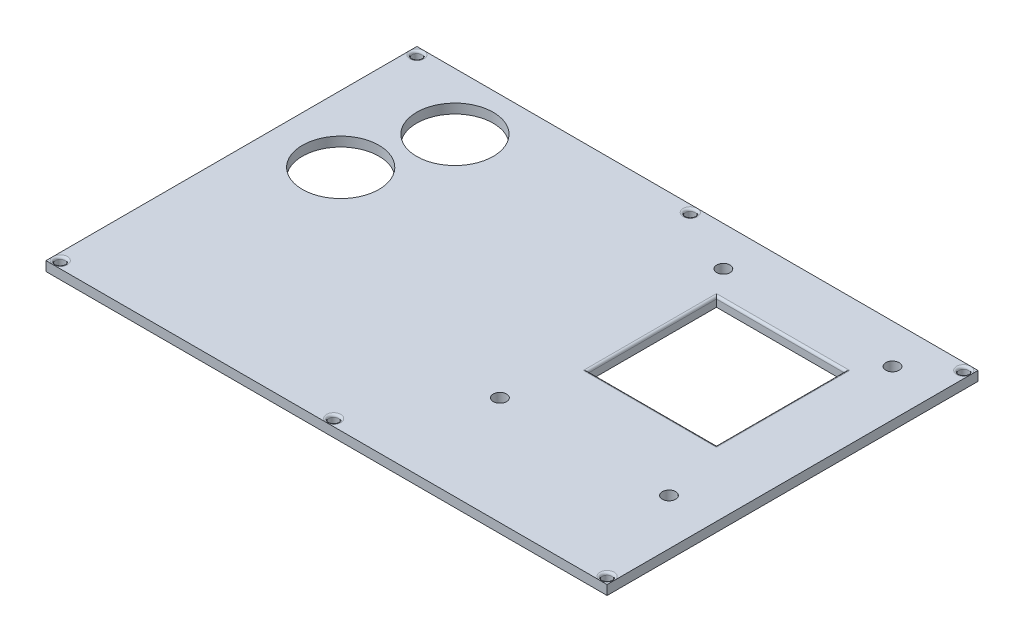
ISO-10303-21;
HEADER;
FILE_DESCRIPTION(('STEP AP214'),'2;1');
FILE_NAME('part.step','',(''),(''),'','','');
FILE_SCHEMA(('AUTOMOTIVE_DESIGN { 1 0 10303 214 1 1 1 1 }'));
ENDSEC;
DATA;
#1=APPLICATION_CONTEXT('core data for automotive mechanical design processes');
#2=APPLICATION_PROTOCOL_DEFINITION('international standard','automotive_design',2000,#1);
#3=PRODUCT_CONTEXT('',#1,'mechanical');
#4=PRODUCT('Part','Part','',(#3));
#5=PRODUCT_RELATED_PRODUCT_CATEGORY('part','',(#4));
#6=PRODUCT_DEFINITION_FORMATION('','',#4);
#7=PRODUCT_DEFINITION_CONTEXT('part definition',#1,'design');
#8=PRODUCT_DEFINITION('design','',#6,#7);
#9=PRODUCT_DEFINITION_SHAPE('','',#8);
#10=(LENGTH_UNIT() NAMED_UNIT(*) SI_UNIT(.MILLI.,.METRE.));
#11=(NAMED_UNIT(*) PLANE_ANGLE_UNIT() SI_UNIT($,.RADIAN.));
#12=(NAMED_UNIT(*) SI_UNIT($,.STERADIAN.) SOLID_ANGLE_UNIT());
#13=UNCERTAINTY_MEASURE_WITH_UNIT(LENGTH_MEASURE(1.E-05),#10,'distance_accuracy_value','');
#14=(GEOMETRIC_REPRESENTATION_CONTEXT(3) GLOBAL_UNCERTAINTY_ASSIGNED_CONTEXT((#13)) GLOBAL_UNIT_ASSIGNED_CONTEXT((#10,
#11,#12)) REPRESENTATION_CONTEXT('',''));
#15=CARTESIAN_POINT('',(0.,0.,0.));
#16=DIRECTION('',(0.,0.,1.));
#17=DIRECTION('',(1.,0.,0.));
#18=AXIS2_PLACEMENT_3D('',#15,#16,#17);
#19=CARTESIAN_POINT('',(0.,2.,0.));
#20=DIRECTION('',(0.,1.,0.));
#21=DIRECTION('',(0.,0.,1.));
#22=AXIS2_PLACEMENT_3D('',#19,#20,#21);
#23=PLANE('',#22);
#24=DIRECTION('',(1.,0.,0.));
#25=VECTOR('',#24,1.);
#26=CARTESIAN_POINT('',(18.,2.,2.50000000000001));
#27=LINE('',#26,#25);
#28=CARTESIAN_POINT('',(45.5,2.,2.50000000000001));
#29=VERTEX_POINT('',#28);
#30=CARTESIAN_POINT('',(17.5,2.,2.50000000000001));
#31=VERTEX_POINT('',#30);
#32=EDGE_CURVE('E305',#29,#31,#27,.F.);
#33=ORIENTED_EDGE('',*,*,#32,.T.);
#34=DIRECTION('',(0.,0.,1.));
#35=VECTOR('',#34,1.);
#36=CARTESIAN_POINT('',(17.5,2.,-25.));
#37=LINE('',#36,#35);
#38=CARTESIAN_POINT('',(17.5,2.,-25.5));
#39=VERTEX_POINT('',#38);
#40=EDGE_CURVE('E314',#31,#39,#37,.F.);
#41=ORIENTED_EDGE('',*,*,#40,.T.);
#42=DIRECTION('',(-1.,0.,0.));
#43=VECTOR('',#42,1.);
#44=CARTESIAN_POINT('',(45.,2.,-25.5));
#45=LINE('',#44,#43);
#46=CARTESIAN_POINT('',(45.5,2.,-25.5));
#47=VERTEX_POINT('',#46);
#48=EDGE_CURVE('E311',#39,#47,#45,.F.);
#49=ORIENTED_EDGE('',*,*,#48,.T.);
#50=DIRECTION('',(0.,0.,-1.));
#51=VECTOR('',#50,1.);
#52=CARTESIAN_POINT('',(45.5,2.,2.00000000000001));
#53=LINE('',#52,#51);
#54=EDGE_CURVE('E308',#47,#29,#53,.F.);
#55=ORIENTED_EDGE('',*,*,#54,.T.);
#56=EDGE_LOOP('',(#33,#41,#49,#55));
#57=FACE_BOUND('',#56,.T.);
#58=CARTESIAN_POINT('',(-45.,2.,-8.97224362268004));
#59=DIRECTION('',(0.,1.,0.));
#60=DIRECTION('',(0.,0.,1.));
#61=AXIS2_PLACEMENT_3D('',#58,#59,#60);
#62=CIRCLE('',#61,8.05);
#63=CARTESIAN_POINT('',(-45.,2.,-0.922243622680039));
#64=VERTEX_POINT('',#63);
#65=EDGE_CURVE('E193',#64,#64,#62,.T.);
#66=ORIENTED_EDGE('',*,*,#65,.F.);
#67=EDGE_LOOP('',(#66));
#68=FACE_BOUND('',#67,.T.);
#69=CARTESIAN_POINT('',(-39.0000000000001,2.,-27.));
#70=DIRECTION('',(0.,1.,0.));
#71=DIRECTION('',(0.,0.,1.));
#72=AXIS2_PLACEMENT_3D('',#69,#70,#71);
#73=CIRCLE('',#72,8.05);
#74=CARTESIAN_POINT('',(-39.0000000000001,2.,-18.95));
#75=VERTEX_POINT('',#74);
#76=EDGE_CURVE('E204',#75,#75,#73,.T.);
#77=ORIENTED_EDGE('',*,*,#76,.F.);
#78=EDGE_LOOP('',(#77));
#79=FACE_BOUND('',#78,.T.);
#80=CARTESIAN_POINT('',(13.72,2.,-30.7313466296643));
#81=DIRECTION('',(0.,1.,0.));
#82=DIRECTION('',(0.,0.,1.));
#83=AXIS2_PLACEMENT_3D('',#80,#81,#82);
#84=CIRCLE('',#83,1.4);
#85=CARTESIAN_POINT('',(13.72,2.,-29.3313466296643));
#86=VERTEX_POINT('',#85);
#87=EDGE_CURVE('E180',#86,#86,#84,.T.);
#88=ORIENTED_EDGE('',*,*,#87,.F.);
#89=EDGE_LOOP('',(#88));
#90=FACE_BOUND('',#89,.T.);
#91=CARTESIAN_POINT('',(49.28,2.,-30.7313466296643));
#92=DIRECTION('',(0.,1.,0.));
#93=DIRECTION('',(0.,0.,1.));
#94=AXIS2_PLACEMENT_3D('',#91,#92,#93);
#95=CIRCLE('',#94,1.4);
#96=CARTESIAN_POINT('',(49.28,2.,-29.3313466296643));
#97=VERTEX_POINT('',#96);
#98=EDGE_CURVE('E395',#97,#97,#95,.T.);
#99=ORIENTED_EDGE('',*,*,#98,.F.);
#100=EDGE_LOOP('',(#99));
#101=FACE_BOUND('',#100,.T.);
#102=CARTESIAN_POINT('',(13.72,2.,16.2586533703357));
#103=DIRECTION('',(0.,1.,0.));
#104=DIRECTION('',(0.,0.,1.));
#105=AXIS2_PLACEMENT_3D('',#102,#103,#104);
#106=CIRCLE('',#105,1.4);
#107=CARTESIAN_POINT('',(13.72,2.,17.6586533703357));
#108=VERTEX_POINT('',#107);
#109=EDGE_CURVE('E403',#108,#108,#106,.T.);
#110=ORIENTED_EDGE('',*,*,#109,.F.);
#111=EDGE_LOOP('',(#110));
#112=FACE_BOUND('',#111,.T.);
#113=CARTESIAN_POINT('',(49.28,2.,16.2586533703357));
#114=DIRECTION('',(0.,1.,0.));
#115=DIRECTION('',(0.,0.,1.));
#116=AXIS2_PLACEMENT_3D('',#113,#114,#115);
#117=CIRCLE('',#116,1.4);
#118=CARTESIAN_POINT('',(49.28,2.,17.6586533703357));
#119=VERTEX_POINT('',#118);
#120=EDGE_CURVE('E183',#119,#119,#117,.T.);
#121=ORIENTED_EDGE('',*,*,#120,.F.);
#122=EDGE_LOOP('',(#121));
#123=FACE_BOUND('',#122,.T.);
#124=DIRECTION('',(1.,0.,0.));
#125=VECTOR('',#124,1.);
#126=CARTESIAN_POINT('',(-59.,2.,39.));
#127=LINE('',#126,#125);
#128=CARTESIAN_POINT('',(0.,2.,39.));
#129=VERTEX_POINT('',#128);
#130=CARTESIAN_POINT('',(57.5,2.,39.));
#131=VERTEX_POINT('',#130);
#132=EDGE_CURVE('E425',#129,#131,#127,.T.);
#133=ORIENTED_EDGE('',*,*,#132,.T.);
#134=CARTESIAN_POINT('',(57.5,2.,37.5));
#135=DIRECTION('',(0.,1.,0.));
#136=DIRECTION('',(0.,0.,1.));
#137=AXIS2_PLACEMENT_3D('',#134,#135,#136);
#138=CIRCLE('',#137,1.5);
#139=CARTESIAN_POINT('',(59.,2.,37.5));
#140=VERTEX_POINT('',#139);
#141=EDGE_CURVE('E301',#131,#140,#138,.F.);
#142=ORIENTED_EDGE('',*,*,#141,.T.);
#143=DIRECTION('',(0.,0.,-1.));
#144=VECTOR('',#143,1.);
#145=CARTESIAN_POINT('',(59.,2.,-39.));
#146=LINE('',#145,#144);
#147=CARTESIAN_POINT('',(59.,2.,-37.5));
#148=VERTEX_POINT('',#147);
#149=EDGE_CURVE('E220',#140,#148,#146,.T.);
#150=ORIENTED_EDGE('',*,*,#149,.T.);
#151=CARTESIAN_POINT('',(57.5,2.,-37.5));
#152=DIRECTION('',(0.,1.,0.));
#153=DIRECTION('',(0.,0.,1.));
#154=AXIS2_PLACEMENT_3D('',#151,#152,#153);
#155=CIRCLE('',#154,1.5);
#156=CARTESIAN_POINT('',(57.5,2.,-39.));
#157=VERTEX_POINT('',#156);
#158=EDGE_CURVE('E291',#148,#157,#155,.F.);
#159=ORIENTED_EDGE('',*,*,#158,.T.);
#160=DIRECTION('',(-1.,0.,0.));
#161=VECTOR('',#160,1.);
#162=CARTESIAN_POINT('',(-59.,2.,-39.));
#163=LINE('',#162,#161);
#164=CARTESIAN_POINT('',(0.,2.,-39.));
#165=VERTEX_POINT('',#164);
#166=EDGE_CURVE('E227',#157,#165,#163,.T.);
#167=ORIENTED_EDGE('',*,*,#166,.T.);
#168=CARTESIAN_POINT('',(0.,2.,-37.5));
#169=DIRECTION('',(0.,1.,0.));
#170=DIRECTION('',(0.,0.,1.));
#171=AXIS2_PLACEMENT_3D('',#168,#169,#170);
#172=CIRCLE('',#171,1.5);
#173=EDGE_CURVE('E287',#165,#165,#172,.F.);
#174=ORIENTED_EDGE('',*,*,#173,.T.);
#175=CARTESIAN_POINT('',(-57.5,2.,-39.));
#176=VERTEX_POINT('',#175);
#177=EDGE_CURVE('E449',#165,#176,#163,.T.);
#178=ORIENTED_EDGE('',*,*,#177,.T.);
#179=CARTESIAN_POINT('',(-57.5,2.,-37.5));
#180=DIRECTION('',(0.,1.,0.));
#181=DIRECTION('',(0.,0.,1.));
#182=AXIS2_PLACEMENT_3D('',#179,#180,#181);
#183=CIRCLE('',#182,1.5);
#184=CARTESIAN_POINT('',(-59.,2.,-37.5));
#185=VERTEX_POINT('',#184);
#186=EDGE_CURVE('E269',#176,#185,#183,.F.);
#187=ORIENTED_EDGE('',*,*,#186,.T.);
#188=DIRECTION('',(0.,0.,1.));
#189=VECTOR('',#188,1.);
#190=CARTESIAN_POINT('',(-59.,2.,-39.));
#191=LINE('',#190,#189);
#192=CARTESIAN_POINT('',(-59.,2.,37.5));
#193=VERTEX_POINT('',#192);
#194=EDGE_CURVE('E233',#185,#193,#191,.T.);
#195=ORIENTED_EDGE('',*,*,#194,.T.);
#196=CARTESIAN_POINT('',(-57.5,2.,37.5));
#197=DIRECTION('',(0.,1.,0.));
#198=DIRECTION('',(0.,0.,1.));
#199=AXIS2_PLACEMENT_3D('',#196,#197,#198);
#200=CIRCLE('',#199,1.5);
#201=CARTESIAN_POINT('',(-57.5,2.,39.));
#202=VERTEX_POINT('',#201);
#203=EDGE_CURVE('E276',#193,#202,#200,.F.);
#204=ORIENTED_EDGE('',*,*,#203,.T.);
#205=EDGE_CURVE('E239',#202,#129,#127,.T.);
#206=ORIENTED_EDGE('',*,*,#205,.T.);
#207=CARTESIAN_POINT('',(0.,2.,37.5));
#208=DIRECTION('',(0.,1.,0.));
#209=DIRECTION('',(0.,0.,1.));
#210=AXIS2_PLACEMENT_3D('',#207,#208,#209);
#211=CIRCLE('',#210,1.5);
#212=EDGE_CURVE('E283',#129,#129,#211,.F.);
#213=ORIENTED_EDGE('',*,*,#212,.T.);
#214=EDGE_LOOP('',(#133,#142,#150,#159,#167,#174,#178,#187,#195,#204,#206,#213));
#215=FACE_BOUND('',#214,.T.);
#216=ADVANCED_FACE('F39',(#57,#68,#79,#90,#101,#112,#123,#215),#23,.T.);
#217=CARTESIAN_POINT('',(59.,2.,-39.));
#218=VERTEX_POINT('',#217);
#219=EDGE_CURVE('E222',#218,#157,#163,.T.);
#220=ORIENTED_EDGE('',*,*,#219,.T.);
#221=CARTESIAN_POINT('',(57.5,2.,-37.5));
#222=DIRECTION('',(0.,1.,0.));
#223=DIRECTION('',(0.,0.,1.));
#224=AXIS2_PLACEMENT_3D('',#221,#222,#223);
#225=CIRCLE('',#224,1.5);
#226=EDGE_CURVE('E294',#157,#148,#225,.F.);
#227=ORIENTED_EDGE('',*,*,#226,.T.);
#228=EDGE_CURVE('E221',#148,#218,#146,.T.);
#229=ORIENTED_EDGE('',*,*,#228,.T.);
#230=EDGE_LOOP('',(#220,#227,#229));
#231=FACE_BOUND('',#230,.T.);
#232=ADVANCED_FACE('F419',(#231),#23,.T.);
#233=CARTESIAN_POINT('',(-59.,2.,39.));
#234=VERTEX_POINT('',#233);
#235=EDGE_CURVE('E234',#234,#202,#127,.T.);
#236=ORIENTED_EDGE('',*,*,#235,.T.);
#237=CARTESIAN_POINT('',(-57.5,2.,37.5));
#238=DIRECTION('',(0.,1.,0.));
#239=DIRECTION('',(0.,0.,1.));
#240=AXIS2_PLACEMENT_3D('',#237,#238,#239);
#241=CIRCLE('',#240,1.5);
#242=EDGE_CURVE('E279',#202,#193,#241,.F.);
#243=ORIENTED_EDGE('',*,*,#242,.T.);
#244=EDGE_CURVE('E226',#193,#234,#191,.T.);
#245=ORIENTED_EDGE('',*,*,#244,.T.);
#246=EDGE_LOOP('',(#236,#243,#245));
#247=FACE_BOUND('',#246,.T.);
#248=ADVANCED_FACE('F723',(#247),#23,.T.);
#249=CARTESIAN_POINT('',(-59.,2.,-39.));
#250=VERTEX_POINT('',#249);
#251=EDGE_CURVE('E228',#250,#185,#191,.T.);
#252=ORIENTED_EDGE('',*,*,#251,.T.);
#253=CARTESIAN_POINT('',(-57.5,2.,-37.5));
#254=DIRECTION('',(0.,1.,0.));
#255=DIRECTION('',(0.,0.,1.));
#256=AXIS2_PLACEMENT_3D('',#253,#254,#255);
#257=CIRCLE('',#256,1.5);
#258=EDGE_CURVE('E272',#185,#176,#257,.F.);
#259=ORIENTED_EDGE('',*,*,#258,.T.);
#260=EDGE_CURVE('E219',#176,#250,#163,.T.);
#261=ORIENTED_EDGE('',*,*,#260,.T.);
#262=EDGE_LOOP('',(#252,#259,#261));
#263=FACE_BOUND('',#262,.T.);
#264=ADVANCED_FACE('F479',(#263),#23,.T.);
#265=CARTESIAN_POINT('',(59.,2.,-39.));
#266=DIRECTION('',(-1.,0.,0.));
#267=DIRECTION('',(0.,0.,1.));
#268=AXIS2_PLACEMENT_3D('',#265,#266,#267);
#269=PLANE('',#268);
#270=DIRECTION('',(0.,0.,-1.));
#271=VECTOR('',#270,1.);
#272=CARTESIAN_POINT('',(59.,0.,-39.));
#273=LINE('',#272,#271);
#274=CARTESIAN_POINT('',(59.,0.,39.));
#275=VERTEX_POINT('',#274);
#276=CARTESIAN_POINT('',(59.,0.,-39.));
#277=VERTEX_POINT('',#276);
#278=EDGE_CURVE('E203',#275,#277,#273,.T.);
#279=ORIENTED_EDGE('',*,*,#278,.T.);
#280=DIRECTION('',(0.,-1.,0.));
#281=VECTOR('',#280,1.);
#282=CARTESIAN_POINT('',(59.,2.,-39.));
#283=LINE('',#282,#281);
#284=EDGE_CURVE('E263',#218,#277,#283,.T.);
#285=ORIENTED_EDGE('',*,*,#284,.F.);
#286=ORIENTED_EDGE('',*,*,#228,.F.);
#287=ORIENTED_EDGE('',*,*,#149,.F.);
#288=CARTESIAN_POINT('',(59.,2.,39.));
#289=VERTEX_POINT('',#288);
#290=EDGE_CURVE('E215',#289,#140,#146,.T.);
#291=ORIENTED_EDGE('',*,*,#290,.F.);
#292=DIRECTION('',(0.,-1.,0.));
#293=VECTOR('',#292,1.);
#294=CARTESIAN_POINT('',(59.,2.,39.));
#295=LINE('',#294,#293);
#296=EDGE_CURVE('E238',#289,#275,#295,.T.);
#297=ORIENTED_EDGE('',*,*,#296,.T.);
#298=EDGE_LOOP('',(#279,#285,#286,#287,#291,#297));
#299=FACE_BOUND('',#298,.T.);
#300=ADVANCED_FACE('F464',(#299),#269,.F.);
#301=CARTESIAN_POINT('',(-59.,2.,-39.));
#302=DIRECTION('',(0.,0.,1.));
#303=DIRECTION('',(1.,0.,0.));
#304=AXIS2_PLACEMENT_3D('',#301,#302,#303);
#305=PLANE('',#304);
#306=DIRECTION('',(-1.,0.,0.));
#307=VECTOR('',#306,1.);
#308=CARTESIAN_POINT('',(-59.,0.,-39.));
#309=LINE('',#308,#307);
#310=CARTESIAN_POINT('',(-59.,0.,-39.));
#311=VERTEX_POINT('',#310);
#312=EDGE_CURVE('E243',#277,#311,#309,.T.);
#313=ORIENTED_EDGE('',*,*,#312,.T.);
#314=DIRECTION('',(0.,-1.,0.));
#315=VECTOR('',#314,1.);
#316=CARTESIAN_POINT('',(-59.,2.,-39.));
#317=LINE('',#316,#315);
#318=EDGE_CURVE('E259',#250,#311,#317,.T.);
#319=ORIENTED_EDGE('',*,*,#318,.F.);
#320=ORIENTED_EDGE('',*,*,#260,.F.);
#321=ORIENTED_EDGE('',*,*,#177,.F.);
#322=ORIENTED_EDGE('',*,*,#166,.F.);
#323=ORIENTED_EDGE('',*,*,#219,.F.);
#324=ORIENTED_EDGE('',*,*,#284,.T.);
#325=EDGE_LOOP('',(#313,#319,#320,#321,#322,#323,#324));
#326=FACE_BOUND('',#325,.T.);
#327=ADVANCED_FACE('F462',(#326),#305,.F.);
#328=CARTESIAN_POINT('',(-59.,2.,-39.));
#329=DIRECTION('',(1.,0.,0.));
#330=DIRECTION('',(0.,0.,-1.));
#331=AXIS2_PLACEMENT_3D('',#328,#329,#330);
#332=PLANE('',#331);
#333=DIRECTION('',(0.,0.,1.));
#334=VECTOR('',#333,1.);
#335=CARTESIAN_POINT('',(-59.,0.,-39.));
#336=LINE('',#335,#334);
#337=CARTESIAN_POINT('',(-59.,0.,39.));
#338=VERTEX_POINT('',#337);
#339=EDGE_CURVE('E246',#311,#338,#336,.T.);
#340=ORIENTED_EDGE('',*,*,#339,.T.);
#341=DIRECTION('',(0.,-1.,0.));
#342=VECTOR('',#341,1.);
#343=CARTESIAN_POINT('',(-59.,2.,39.));
#344=LINE('',#343,#342);
#345=EDGE_CURVE('E255',#234,#338,#344,.T.);
#346=ORIENTED_EDGE('',*,*,#345,.F.);
#347=ORIENTED_EDGE('',*,*,#244,.F.);
#348=ORIENTED_EDGE('',*,*,#194,.F.);
#349=ORIENTED_EDGE('',*,*,#251,.F.);
#350=ORIENTED_EDGE('',*,*,#318,.T.);
#351=EDGE_LOOP('',(#340,#346,#347,#348,#349,#350));
#352=FACE_BOUND('',#351,.T.);
#353=ADVANCED_FACE('F473',(#352),#332,.F.);
#354=CARTESIAN_POINT('',(-59.,2.,39.));
#355=DIRECTION('',(0.,0.,-1.));
#356=DIRECTION('',(-1.,0.,0.));
#357=AXIS2_PLACEMENT_3D('',#354,#355,#356);
#358=PLANE('',#357);
#359=DIRECTION('',(1.,0.,0.));
#360=VECTOR('',#359,1.);
#361=CARTESIAN_POINT('',(-59.,0.,39.));
#362=LINE('',#361,#360);
#363=EDGE_CURVE('E249',#338,#275,#362,.T.);
#364=ORIENTED_EDGE('',*,*,#363,.T.);
#365=ORIENTED_EDGE('',*,*,#296,.F.);
#366=EDGE_CURVE('E232',#131,#289,#127,.T.);
#367=ORIENTED_EDGE('',*,*,#366,.F.);
#368=ORIENTED_EDGE('',*,*,#132,.F.);
#369=ORIENTED_EDGE('',*,*,#205,.F.);
#370=ORIENTED_EDGE('',*,*,#235,.F.);
#371=ORIENTED_EDGE('',*,*,#345,.T.);
#372=EDGE_LOOP('',(#364,#365,#367,#368,#369,#370,#371));
#373=FACE_BOUND('',#372,.T.);
#374=ADVANCED_FACE('F440',(#373),#358,.F.);
#375=ORIENTED_EDGE('',*,*,#290,.T.);
#376=CARTESIAN_POINT('',(57.5,2.,37.5));
#377=DIRECTION('',(0.,1.,0.));
#378=DIRECTION('',(0.,0.,1.));
#379=AXIS2_PLACEMENT_3D('',#376,#377,#378);
#380=CIRCLE('',#379,1.5);
#381=EDGE_CURVE('E298',#140,#131,#380,.F.);
#382=ORIENTED_EDGE('',*,*,#381,.T.);
#383=ORIENTED_EDGE('',*,*,#366,.T.);
#384=EDGE_LOOP('',(#375,#382,#383));
#385=FACE_BOUND('',#384,.T.);
#386=ADVANCED_FACE('F422',(#385),#23,.T.);
#387=CARTESIAN_POINT('',(0.,0.,0.));
#388=DIRECTION('',(0.,1.,0.));
#389=DIRECTION('',(0.,0.,1.));
#390=AXIS2_PLACEMENT_3D('',#387,#388,#389);
#391=PLANE('',#390);
#392=CARTESIAN_POINT('',(-57.5,0.,37.5));
#393=DIRECTION('',(0.,1.,0.));
#394=DIRECTION('',(0.,0.,1.));
#395=AXIS2_PLACEMENT_3D('',#392,#393,#394);
#396=CIRCLE('',#395,0.999999999999998);
#397=CARTESIAN_POINT('',(-57.5,0.,38.5));
#398=VERTEX_POINT('',#397);
#399=EDGE_CURVE('E373',#398,#398,#396,.T.);
#400=ORIENTED_EDGE('',*,*,#399,.T.);
#401=EDGE_LOOP('',(#400));
#402=FACE_BOUND('',#401,.T.);
#403=CARTESIAN_POINT('',(57.5,0.,37.5));
#404=DIRECTION('',(0.,1.,0.));
#405=DIRECTION('',(0.,0.,1.));
#406=AXIS2_PLACEMENT_3D('',#403,#404,#405);
#407=CIRCLE('',#406,0.999999999999998);
#408=CARTESIAN_POINT('',(57.5,0.,38.5));
#409=VERTEX_POINT('',#408);
#410=EDGE_CURVE('E378',#409,#409,#407,.T.);
#411=ORIENTED_EDGE('',*,*,#410,.T.);
#412=EDGE_LOOP('',(#411));
#413=FACE_BOUND('',#412,.T.);
#414=CARTESIAN_POINT('',(57.5,0.,-37.5));
#415=DIRECTION('',(0.,1.,0.));
#416=DIRECTION('',(0.,0.,1.));
#417=AXIS2_PLACEMENT_3D('',#414,#415,#416);
#418=CIRCLE('',#417,0.999999999999998);
#419=CARTESIAN_POINT('',(57.5,0.,-36.5));
#420=VERTEX_POINT('',#419);
#421=EDGE_CURVE('E370',#420,#420,#418,.T.);
#422=ORIENTED_EDGE('',*,*,#421,.T.);
#423=EDGE_LOOP('',(#422));
#424=FACE_BOUND('',#423,.T.);
#425=CARTESIAN_POINT('',(0.,0.,-37.5));
#426=DIRECTION('',(0.,1.,0.));
#427=DIRECTION('',(0.,0.,1.));
#428=AXIS2_PLACEMENT_3D('',#425,#426,#427);
#429=CIRCLE('',#428,1.);
#430=CARTESIAN_POINT('',(0.,0.,-36.5));
#431=VERTEX_POINT('',#430);
#432=EDGE_CURVE('E364',#431,#431,#429,.T.);
#433=ORIENTED_EDGE('',*,*,#432,.T.);
#434=EDGE_LOOP('',(#433));
#435=FACE_BOUND('',#434,.T.);
#436=CARTESIAN_POINT('',(0.,0.,37.5));
#437=DIRECTION('',(0.,1.,0.));
#438=DIRECTION('',(0.,0.,1.));
#439=AXIS2_PLACEMENT_3D('',#436,#437,#438);
#440=CIRCLE('',#439,1.);
#441=CARTESIAN_POINT('',(0.,0.,38.5));
#442=VERTEX_POINT('',#441);
#443=EDGE_CURVE('E357',#442,#442,#440,.T.);
#444=ORIENTED_EDGE('',*,*,#443,.T.);
#445=EDGE_LOOP('',(#444));
#446=FACE_BOUND('',#445,.T.);
#447=CARTESIAN_POINT('',(-57.5,0.,-37.5));
#448=DIRECTION('',(0.,1.,0.));
#449=DIRECTION('',(0.,0.,1.));
#450=AXIS2_PLACEMENT_3D('',#447,#448,#449);
#451=CIRCLE('',#450,0.999999999999998);
#452=CARTESIAN_POINT('',(-57.5,0.,-36.5));
#453=VERTEX_POINT('',#452);
#454=EDGE_CURVE('E377',#453,#453,#451,.T.);
#455=ORIENTED_EDGE('',*,*,#454,.T.);
#456=EDGE_LOOP('',(#455));
#457=FACE_BOUND('',#456,.T.);
#458=CARTESIAN_POINT('',(49.28,0.,16.2586533703357));
#459=DIRECTION('',(0.,1.,0.));
#460=DIRECTION('',(0.,0.,1.));
#461=AXIS2_PLACEMENT_3D('',#458,#459,#460);
#462=CIRCLE('',#461,1.4);
#463=CARTESIAN_POINT('',(49.28,0.,17.6586533703357));
#464=VERTEX_POINT('',#463);
#465=EDGE_CURVE('E406',#464,#464,#462,.T.);
#466=ORIENTED_EDGE('',*,*,#465,.T.);
#467=EDGE_LOOP('',(#466));
#468=FACE_BOUND('',#467,.T.);
#469=CARTESIAN_POINT('',(13.72,0.,16.2586533703357));
#470=DIRECTION('',(0.,1.,0.));
#471=DIRECTION('',(0.,0.,1.));
#472=AXIS2_PLACEMENT_3D('',#469,#470,#471);
#473=CIRCLE('',#472,1.4);
#474=CARTESIAN_POINT('',(13.72,0.,17.6586533703357));
#475=VERTEX_POINT('',#474);
#476=EDGE_CURVE('E399',#475,#475,#473,.T.);
#477=ORIENTED_EDGE('',*,*,#476,.T.);
#478=EDGE_LOOP('',(#477));
#479=FACE_BOUND('',#478,.T.);
#480=CARTESIAN_POINT('',(49.28,0.,-30.7313466296643));
#481=DIRECTION('',(0.,1.,0.));
#482=DIRECTION('',(0.,0.,1.));
#483=AXIS2_PLACEMENT_3D('',#480,#481,#482);
#484=CIRCLE('',#483,1.4);
#485=CARTESIAN_POINT('',(49.28,0.,-29.3313466296643));
#486=VERTEX_POINT('',#485);
#487=EDGE_CURVE('E391',#486,#486,#484,.T.);
#488=ORIENTED_EDGE('',*,*,#487,.T.);
#489=EDGE_LOOP('',(#488));
#490=FACE_BOUND('',#489,.T.);
#491=CARTESIAN_POINT('',(13.72,0.,-30.7313466296643));
#492=DIRECTION('',(0.,1.,0.));
#493=DIRECTION('',(0.,0.,1.));
#494=AXIS2_PLACEMENT_3D('',#491,#492,#493);
#495=CIRCLE('',#494,1.4);
#496=CARTESIAN_POINT('',(13.72,0.,-29.3313466296643));
#497=VERTEX_POINT('',#496);
#498=EDGE_CURVE('E176',#497,#497,#495,.T.);
#499=ORIENTED_EDGE('',*,*,#498,.T.);
#500=EDGE_LOOP('',(#499));
#501=FACE_BOUND('',#500,.T.);
#502=DIRECTION('',(-1.,0.,0.));
#503=VECTOR('',#502,1.);
#504=CARTESIAN_POINT('',(18.,0.,-25.));
#505=LINE('',#504,#503);
#506=CARTESIAN_POINT('',(45.,0.,-25.));
#507=VERTEX_POINT('',#506);
#508=CARTESIAN_POINT('',(18.,0.,-25.));
#509=VERTEX_POINT('',#508);
#510=EDGE_CURVE('E162',#507,#509,#505,.T.);
#511=ORIENTED_EDGE('',*,*,#510,.T.);
#512=DIRECTION('',(0.,0.,1.));
#513=VECTOR('',#512,1.);
#514=CARTESIAN_POINT('',(18.,0.,-25.));
#515=LINE('',#514,#513);
#516=CARTESIAN_POINT('',(18.,0.,2.00000000000001));
#517=VERTEX_POINT('',#516);
#518=EDGE_CURVE('E156',#509,#517,#515,.T.);
#519=ORIENTED_EDGE('',*,*,#518,.T.);
#520=DIRECTION('',(1.,0.,0.));
#521=VECTOR('',#520,1.);
#522=CARTESIAN_POINT('',(18.,0.,2.00000000000001));
#523=LINE('',#522,#521);
#524=CARTESIAN_POINT('',(45.,0.,2.00000000000001));
#525=VERTEX_POINT('',#524);
#526=EDGE_CURVE('E165',#517,#525,#523,.T.);
#527=ORIENTED_EDGE('',*,*,#526,.T.);
#528=DIRECTION('',(0.,0.,-1.));
#529=VECTOR('',#528,1.);
#530=CARTESIAN_POINT('',(45.,0.,-25.));
#531=LINE('',#530,#529);
#532=EDGE_CURVE('E170',#525,#507,#531,.T.);
#533=ORIENTED_EDGE('',*,*,#532,.T.);
#534=EDGE_LOOP('',(#511,#519,#527,#533));
#535=FACE_BOUND('',#534,.T.);
#536=CARTESIAN_POINT('',(-39.0000000000001,0.,-27.));
#537=DIRECTION('',(0.,1.,0.));
#538=DIRECTION('',(0.,0.,1.));
#539=AXIS2_PLACEMENT_3D('',#536,#537,#538);
#540=CIRCLE('',#539,8.05);
#541=CARTESIAN_POINT('',(-39.0000000000001,0.,-18.95));
#542=VERTEX_POINT('',#541);
#543=EDGE_CURVE('E199',#542,#542,#540,.T.);
#544=ORIENTED_EDGE('',*,*,#543,.T.);
#545=EDGE_LOOP('',(#544));
#546=FACE_BOUND('',#545,.T.);
#547=CARTESIAN_POINT('',(-45.,0.,-8.97224362268004));
#548=DIRECTION('',(0.,1.,0.));
#549=DIRECTION('',(0.,0.,1.));
#550=AXIS2_PLACEMENT_3D('',#547,#548,#549);
#551=CIRCLE('',#550,8.05);
#552=CARTESIAN_POINT('',(-45.,0.,-0.922243622680039));
#553=VERTEX_POINT('',#552);
#554=EDGE_CURVE('E208',#553,#553,#551,.T.);
#555=ORIENTED_EDGE('',*,*,#554,.T.);
#556=EDGE_LOOP('',(#555));
#557=FACE_BOUND('',#556,.T.);
#558=ORIENTED_EDGE('',*,*,#278,.F.);
#559=ORIENTED_EDGE('',*,*,#363,.F.);
#560=ORIENTED_EDGE('',*,*,#339,.F.);
#561=ORIENTED_EDGE('',*,*,#312,.F.);
#562=EDGE_LOOP('',(#558,#559,#560,#561));
#563=FACE_BOUND('',#562,.T.);
#564=ADVANCED_FACE('F172',(#402,#413,#424,#435,#446,#457,#468,#479,#490,#501,#535,#546,#557,
#563),#391,.F.);
#565=CARTESIAN_POINT('',(-45.,0.,-8.97224362268004));
#566=DIRECTION('',(0.,1.,0.));
#567=DIRECTION('',(0.,0.,1.));
#568=AXIS2_PLACEMENT_3D('',#565,#566,#567);
#569=CYLINDRICAL_SURFACE('',#568,8.05);
#570=ORIENTED_EDGE('',*,*,#554,.F.);
#571=EDGE_LOOP('',(#570));
#572=FACE_BOUND('',#571,.T.);
#573=ORIENTED_EDGE('',*,*,#65,.T.);
#574=EDGE_LOOP('',(#573));
#575=FACE_BOUND('',#574,.T.);
#576=ADVANCED_FACE('F500',(#572,#575),#569,.F.);
#577=CARTESIAN_POINT('',(-39.0000000000001,0.,-27.));
#578=DIRECTION('',(0.,1.,0.));
#579=DIRECTION('',(0.,0.,1.));
#580=AXIS2_PLACEMENT_3D('',#577,#578,#579);
#581=CYLINDRICAL_SURFACE('',#580,8.05);
#582=ORIENTED_EDGE('',*,*,#543,.F.);
#583=EDGE_LOOP('',(#582));
#584=FACE_BOUND('',#583,.T.);
#585=ORIENTED_EDGE('',*,*,#76,.T.);
#586=EDGE_LOOP('',(#585));
#587=FACE_BOUND('',#586,.T.);
#588=ADVANCED_FACE('F550',(#584,#587),#581,.F.);
#589=CARTESIAN_POINT('',(18.,0.,-25.));
#590=DIRECTION('',(-1.,0.,0.));
#591=DIRECTION('',(0.,0.,1.));
#592=AXIS2_PLACEMENT_3D('',#589,#590,#591);
#593=PLANE('',#592);
#594=DIRECTION('',(0.,1.,0.));
#595=VECTOR('',#594,1.);
#596=CARTESIAN_POINT('',(18.,0.,-25.));
#597=LINE('',#596,#595);
#598=CARTESIAN_POINT('',(18.,1.5,-25.));
#599=VERTEX_POINT('',#598);
#600=EDGE_CURVE('E190',#509,#599,#597,.T.);
#601=ORIENTED_EDGE('',*,*,#600,.T.);
#602=DIRECTION('',(0.,0.,1.));
#603=VECTOR('',#602,1.);
#604=CARTESIAN_POINT('',(18.,1.5,2.00000000000001));
#605=LINE('',#604,#603);
#606=CARTESIAN_POINT('',(18.,1.5,2.00000000000001));
#607=VERTEX_POINT('',#606);
#608=EDGE_CURVE('E159',#599,#607,#605,.T.);
#609=ORIENTED_EDGE('',*,*,#608,.T.);
#610=DIRECTION('',(0.,1.,0.));
#611=VECTOR('',#610,1.);
#612=CARTESIAN_POINT('',(18.,0.,2.00000000000001));
#613=LINE('',#612,#611);
#614=EDGE_CURVE('E151',#517,#607,#613,.T.);
#615=ORIENTED_EDGE('',*,*,#614,.F.);
#616=ORIENTED_EDGE('',*,*,#518,.F.);
#617=EDGE_LOOP('',(#601,#609,#615,#616));
#618=FACE_BOUND('',#617,.T.);
#619=ADVANCED_FACE('F154',(#618),#593,.F.);
#620=CARTESIAN_POINT('',(18.,0.,-25.));
#621=DIRECTION('',(0.,0.,-1.));
#622=DIRECTION('',(-1.,0.,0.));
#623=AXIS2_PLACEMENT_3D('',#620,#621,#622);
#624=PLANE('',#623);
#625=DIRECTION('',(0.,1.,0.));
#626=VECTOR('',#625,1.);
#627=CARTESIAN_POINT('',(45.,0.,-25.));
#628=LINE('',#627,#626);
#629=CARTESIAN_POINT('',(45.,1.5,-25.));
#630=VERTEX_POINT('',#629);
#631=EDGE_CURVE('E194',#507,#630,#628,.T.);
#632=ORIENTED_EDGE('',*,*,#631,.T.);
#633=DIRECTION('',(-1.,0.,0.));
#634=VECTOR('',#633,1.);
#635=CARTESIAN_POINT('',(18.,1.5,-25.));
#636=LINE('',#635,#634);
#637=EDGE_CURVE('E318',#630,#599,#636,.T.);
#638=ORIENTED_EDGE('',*,*,#637,.T.);
#639=ORIENTED_EDGE('',*,*,#600,.F.);
#640=ORIENTED_EDGE('',*,*,#510,.F.);
#641=EDGE_LOOP('',(#632,#638,#639,#640));
#642=FACE_BOUND('',#641,.T.);
#643=ADVANCED_FACE('F539',(#642),#624,.F.);
#644=CARTESIAN_POINT('',(45.,0.,-25.));
#645=DIRECTION('',(1.,0.,0.));
#646=DIRECTION('',(0.,0.,-1.));
#647=AXIS2_PLACEMENT_3D('',#644,#645,#646);
#648=PLANE('',#647);
#649=DIRECTION('',(0.,1.,0.));
#650=VECTOR('',#649,1.);
#651=CARTESIAN_POINT('',(45.,0.,2.00000000000001));
#652=LINE('',#651,#650);
#653=CARTESIAN_POINT('',(45.,1.5,2.00000000000001));
#654=VERTEX_POINT('',#653);
#655=EDGE_CURVE('E161',#525,#654,#652,.T.);
#656=ORIENTED_EDGE('',*,*,#655,.T.);
#657=DIRECTION('',(0.,0.,-1.));
#658=VECTOR('',#657,1.);
#659=CARTESIAN_POINT('',(45.,1.5,-25.));
#660=LINE('',#659,#658);
#661=EDGE_CURVE('E64',#654,#630,#660,.T.);
#662=ORIENTED_EDGE('',*,*,#661,.T.);
#663=ORIENTED_EDGE('',*,*,#631,.F.);
#664=ORIENTED_EDGE('',*,*,#532,.F.);
#665=EDGE_LOOP('',(#656,#662,#663,#664));
#666=FACE_BOUND('',#665,.T.);
#667=ADVANCED_FACE('F542',(#666),#648,.F.);
#668=CARTESIAN_POINT('',(18.,0.,2.00000000000001));
#669=DIRECTION('',(0.,0.,1.));
#670=DIRECTION('',(1.,0.,0.));
#671=AXIS2_PLACEMENT_3D('',#668,#669,#670);
#672=PLANE('',#671);
#673=ORIENTED_EDGE('',*,*,#614,.T.);
#674=DIRECTION('',(1.,0.,0.));
#675=VECTOR('',#674,1.);
#676=CARTESIAN_POINT('',(45.,1.5,2.00000000000001));
#677=LINE('',#676,#675);
#678=EDGE_CURVE('E57',#607,#654,#677,.T.);
#679=ORIENTED_EDGE('',*,*,#678,.T.);
#680=ORIENTED_EDGE('',*,*,#655,.F.);
#681=ORIENTED_EDGE('',*,*,#526,.F.);
#682=EDGE_LOOP('',(#673,#679,#680,#681));
#683=FACE_BOUND('',#682,.T.);
#684=ADVANCED_FACE('F166',(#683),#672,.F.);
#685=CARTESIAN_POINT('',(13.72,0.,-30.7313466296643));
#686=DIRECTION('',(0.,1.,0.));
#687=DIRECTION('',(0.,0.,1.));
#688=AXIS2_PLACEMENT_3D('',#685,#686,#687);
#689=CYLINDRICAL_SURFACE('',#688,1.4);
#690=ORIENTED_EDGE('',*,*,#498,.F.);
#691=EDGE_LOOP('',(#690));
#692=FACE_BOUND('',#691,.T.);
#693=ORIENTED_EDGE('',*,*,#87,.T.);
#694=EDGE_LOOP('',(#693));
#695=FACE_BOUND('',#694,.T.);
#696=ADVANCED_FACE('F513',(#692,#695),#689,.F.);
#697=CARTESIAN_POINT('',(49.28,0.,-30.7313466296643));
#698=DIRECTION('',(0.,1.,0.));
#699=DIRECTION('',(0.,0.,1.));
#700=AXIS2_PLACEMENT_3D('',#697,#698,#699);
#701=CYLINDRICAL_SURFACE('',#700,1.4);
#702=ORIENTED_EDGE('',*,*,#487,.F.);
#703=EDGE_LOOP('',(#702));
#704=FACE_BOUND('',#703,.T.);
#705=ORIENTED_EDGE('',*,*,#98,.T.);
#706=EDGE_LOOP('',(#705));
#707=FACE_BOUND('',#706,.T.);
#708=ADVANCED_FACE('F516',(#704,#707),#701,.F.);
#709=CARTESIAN_POINT('',(13.72,0.,16.2586533703357));
#710=DIRECTION('',(0.,1.,0.));
#711=DIRECTION('',(0.,0.,1.));
#712=AXIS2_PLACEMENT_3D('',#709,#710,#711);
#713=CYLINDRICAL_SURFACE('',#712,1.4);
#714=ORIENTED_EDGE('',*,*,#476,.F.);
#715=EDGE_LOOP('',(#714));
#716=FACE_BOUND('',#715,.T.);
#717=ORIENTED_EDGE('',*,*,#109,.T.);
#718=EDGE_LOOP('',(#717));
#719=FACE_BOUND('',#718,.T.);
#720=ADVANCED_FACE('F525',(#716,#719),#713,.F.);
#721=CARTESIAN_POINT('',(49.28,0.,16.2586533703357));
#722=DIRECTION('',(0.,1.,0.));
#723=DIRECTION('',(0.,0.,1.));
#724=AXIS2_PLACEMENT_3D('',#721,#722,#723);
#725=CYLINDRICAL_SURFACE('',#724,1.4);
#726=ORIENTED_EDGE('',*,*,#465,.F.);
#727=EDGE_LOOP('',(#726));
#728=FACE_BOUND('',#727,.T.);
#729=ORIENTED_EDGE('',*,*,#120,.T.);
#730=EDGE_LOOP('',(#729));
#731=FACE_BOUND('',#730,.T.);
#732=ADVANCED_FACE('F415',(#728,#731),#725,.F.);
#733=CARTESIAN_POINT('',(-57.5,0.,-37.5));
#734=DIRECTION('',(0.,1.,0.));
#735=DIRECTION('',(0.,0.,1.));
#736=AXIS2_PLACEMENT_3D('',#733,#734,#735);
#737=CYLINDRICAL_SURFACE('',#736,0.999999999999998);
#738=CARTESIAN_POINT('',(-57.5,1.5,-37.5));
#739=DIRECTION('',(0.,1.,0.));
#740=DIRECTION('',(0.,0.,1.));
#741=AXIS2_PLACEMENT_3D('',#738,#739,#740);
#742=CIRCLE('',#741,0.999999999999998);
#743=CARTESIAN_POINT('',(-57.5,1.5,-36.5));
#744=VERTEX_POINT('',#743);
#745=EDGE_CURVE('E11',#744,#744,#742,.T.);
#746=ORIENTED_EDGE('',*,*,#745,.T.);
#747=EDGE_LOOP('',(#746));
#748=FACE_BOUND('',#747,.T.);
#749=ORIENTED_EDGE('',*,*,#454,.F.);
#750=EDGE_LOOP('',(#749));
#751=FACE_BOUND('',#750,.T.);
#752=ADVANCED_FACE('F533',(#748,#751),#737,.F.);
#753=CARTESIAN_POINT('',(0.,0.,37.5));
#754=DIRECTION('',(0.,1.,0.));
#755=DIRECTION('',(0.,0.,1.));
#756=AXIS2_PLACEMENT_3D('',#753,#754,#755);
#757=CYLINDRICAL_SURFACE('',#756,1.);
#758=CARTESIAN_POINT('',(0.,1.5,37.5));
#759=DIRECTION('',(0.,1.,0.));
#760=DIRECTION('',(0.,0.,1.));
#761=AXIS2_PLACEMENT_3D('',#758,#759,#760);
#762=CIRCLE('',#761,1.);
#763=CARTESIAN_POINT('',(0.,1.5,38.5));
#764=VERTEX_POINT('',#763);
#765=EDGE_CURVE('E337',#764,#764,#762,.T.);
#766=ORIENTED_EDGE('',*,*,#765,.T.);
#767=EDGE_LOOP('',(#766));
#768=FACE_BOUND('',#767,.T.);
#769=ORIENTED_EDGE('',*,*,#443,.F.);
#770=EDGE_LOOP('',(#769));
#771=FACE_BOUND('',#770,.T.);
#772=ADVANCED_FACE('F615',(#768,#771),#757,.F.);
#773=CARTESIAN_POINT('',(0.,0.,-37.5));
#774=DIRECTION('',(0.,1.,0.));
#775=DIRECTION('',(0.,0.,1.));
#776=AXIS2_PLACEMENT_3D('',#773,#774,#775);
#777=CYLINDRICAL_SURFACE('',#776,1.);
#778=CARTESIAN_POINT('',(0.,1.5,-37.5));
#779=DIRECTION('',(0.,1.,0.));
#780=DIRECTION('',(0.,0.,1.));
#781=AXIS2_PLACEMENT_3D('',#778,#779,#780);
#782=CIRCLE('',#781,1.);
#783=CARTESIAN_POINT('',(0.,1.5,-36.5));
#784=VERTEX_POINT('',#783);
#785=EDGE_CURVE('E333',#784,#784,#782,.T.);
#786=ORIENTED_EDGE('',*,*,#785,.T.);
#787=EDGE_LOOP('',(#786));
#788=FACE_BOUND('',#787,.T.);
#789=ORIENTED_EDGE('',*,*,#432,.F.);
#790=EDGE_LOOP('',(#789));
#791=FACE_BOUND('',#790,.T.);
#792=ADVANCED_FACE('F494',(#788,#791),#777,.F.);
#793=CARTESIAN_POINT('',(57.5,0.,-37.5));
#794=DIRECTION('',(0.,1.,0.));
#795=DIRECTION('',(0.,0.,1.));
#796=AXIS2_PLACEMENT_3D('',#793,#794,#795);
#797=CYLINDRICAL_SURFACE('',#796,0.999999999999998);
#798=CARTESIAN_POINT('',(57.5,1.5,-37.5));
#799=DIRECTION('',(0.,1.,0.));
#800=DIRECTION('',(0.,0.,1.));
#801=AXIS2_PLACEMENT_3D('',#798,#799,#800);
#802=CIRCLE('',#801,0.999999999999998);
#803=CARTESIAN_POINT('',(57.5,1.5,-36.5));
#804=VERTEX_POINT('',#803);
#805=EDGE_CURVE('E329',#804,#804,#802,.T.);
#806=ORIENTED_EDGE('',*,*,#805,.T.);
#807=EDGE_LOOP('',(#806));
#808=FACE_BOUND('',#807,.T.);
#809=ORIENTED_EDGE('',*,*,#421,.F.);
#810=EDGE_LOOP('',(#809));
#811=FACE_BOUND('',#810,.T.);
#812=ADVANCED_FACE('F490',(#808,#811),#797,.F.);
#813=CARTESIAN_POINT('',(57.5,0.,37.5));
#814=DIRECTION('',(0.,1.,0.));
#815=DIRECTION('',(0.,0.,1.));
#816=AXIS2_PLACEMENT_3D('',#813,#814,#815);
#817=CYLINDRICAL_SURFACE('',#816,0.999999999999998);
#818=CARTESIAN_POINT('',(57.5,1.5,37.5));
#819=DIRECTION('',(0.,1.,0.));
#820=DIRECTION('',(0.,0.,1.));
#821=AXIS2_PLACEMENT_3D('',#818,#819,#820);
#822=CIRCLE('',#821,0.999999999999998);
#823=CARTESIAN_POINT('',(57.5,1.5,38.5));
#824=VERTEX_POINT('',#823);
#825=EDGE_CURVE('E325',#824,#824,#822,.T.);
#826=ORIENTED_EDGE('',*,*,#825,.T.);
#827=EDGE_LOOP('',(#826));
#828=FACE_BOUND('',#827,.T.);
#829=ORIENTED_EDGE('',*,*,#410,.F.);
#830=EDGE_LOOP('',(#829));
#831=FACE_BOUND('',#830,.T.);
#832=ADVANCED_FACE('F493',(#828,#831),#817,.F.);
#833=CARTESIAN_POINT('',(-57.5,0.,37.5));
#834=DIRECTION('',(0.,1.,0.));
#835=DIRECTION('',(0.,0.,1.));
#836=AXIS2_PLACEMENT_3D('',#833,#834,#835);
#837=CYLINDRICAL_SURFACE('',#836,0.999999999999998);
#838=CARTESIAN_POINT('',(-57.5,1.5,37.5));
#839=DIRECTION('',(0.,1.,0.));
#840=DIRECTION('',(0.,0.,1.));
#841=AXIS2_PLACEMENT_3D('',#838,#839,#840);
#842=CIRCLE('',#841,0.999999999999998);
#843=CARTESIAN_POINT('',(-57.5,1.5,38.5));
#844=VERTEX_POINT('',#843);
#845=EDGE_CURVE('E49',#844,#844,#842,.T.);
#846=ORIENTED_EDGE('',*,*,#845,.T.);
#847=EDGE_LOOP('',(#846));
#848=FACE_BOUND('',#847,.T.);
#849=ORIENTED_EDGE('',*,*,#399,.F.);
#850=EDGE_LOOP('',(#849));
#851=FACE_BOUND('',#850,.T.);
#852=ADVANCED_FACE('F579',(#848,#851),#837,.F.);
#853=CARTESIAN_POINT('',(45.5,1.5,-25.));
#854=DIRECTION('',(0.,0.,1.));
#855=DIRECTION('',(1.,0.,0.));
#856=AXIS2_PLACEMENT_3D('',#853,#854,#855);
#857=CYLINDRICAL_SURFACE('',#856,0.5);
#858=CARTESIAN_POINT('',(45.5,1.5,2.50000000000001));
#859=DIRECTION('',(-0.707106781186547,0.,0.707106781186548));
#860=DIRECTION('',(0.707106781186548,0.,0.707106781186547));
#861=AXIS2_PLACEMENT_3D('',#858,#859,#860);
#862=ELLIPSE('',#861,0.707106781186548,0.5);
#863=EDGE_CURVE('E349',#29,#654,#862,.T.);
#864=ORIENTED_EDGE('',*,*,#863,.F.);
#865=ORIENTED_EDGE('',*,*,#54,.F.);
#866=CARTESIAN_POINT('',(45.5,1.5,-25.5));
#867=DIRECTION('',(0.707106781186548,0.,0.707106781186547));
#868=DIRECTION('',(0.707106781186547,0.,-0.707106781186548));
#869=AXIS2_PLACEMENT_3D('',#866,#867,#868);
#870=ELLIPSE('',#869,0.707106781186547,0.5);
#871=EDGE_CURVE('E43',#630,#47,#870,.F.);
#872=ORIENTED_EDGE('',*,*,#871,.F.);
#873=ORIENTED_EDGE('',*,*,#661,.F.);
#874=EDGE_LOOP('',(#864,#865,#872,#873));
#875=FACE_BOUND('',#874,.T.);
#876=ADVANCED_FACE('F576',(#875),#857,.T.);
#877=CARTESIAN_POINT('',(18.,1.5,-25.5));
#878=DIRECTION('',(1.,0.,0.));
#879=DIRECTION('',(0.,0.,-1.));
#880=AXIS2_PLACEMENT_3D('',#877,#878,#879);
#881=CYLINDRICAL_SURFACE('',#880,0.5);
#882=ORIENTED_EDGE('',*,*,#871,.T.);
#883=ORIENTED_EDGE('',*,*,#48,.F.);
#884=CARTESIAN_POINT('',(17.5,1.5,-25.5));
#885=DIRECTION('',(0.707106781186547,0.,-0.707106781186548));
#886=DIRECTION('',(-0.707106781186548,0.,-0.707106781186547));
#887=AXIS2_PLACEMENT_3D('',#884,#885,#886);
#888=ELLIPSE('',#887,0.707106781186548,0.5);
#889=EDGE_CURVE('E347',#599,#39,#888,.F.);
#890=ORIENTED_EDGE('',*,*,#889,.F.);
#891=ORIENTED_EDGE('',*,*,#637,.F.);
#892=EDGE_LOOP('',(#882,#883,#890,#891));
#893=FACE_BOUND('',#892,.T.);
#894=ADVANCED_FACE('F573',(#893),#881,.T.);
#895=CARTESIAN_POINT('',(18.,1.5,2.50000000000001));
#896=DIRECTION('',(-1.,0.,0.));
#897=DIRECTION('',(0.,0.,1.));
#898=AXIS2_PLACEMENT_3D('',#895,#896,#897);
#899=CYLINDRICAL_SURFACE('',#898,0.5);
#900=ORIENTED_EDGE('',*,*,#863,.T.);
#901=ORIENTED_EDGE('',*,*,#678,.F.);
#902=CARTESIAN_POINT('',(17.5,1.5,2.50000000000001));
#903=DIRECTION('',(-0.707106781186548,0.,-0.707106781186547));
#904=DIRECTION('',(0.707106781186547,0.,-0.707106781186548));
#905=AXIS2_PLACEMENT_3D('',#902,#903,#904);
#906=ELLIPSE('',#905,0.707106781186547,0.5);
#907=EDGE_CURVE('E344',#31,#607,#906,.T.);
#908=ORIENTED_EDGE('',*,*,#907,.F.);
#909=ORIENTED_EDGE('',*,*,#32,.F.);
#910=EDGE_LOOP('',(#900,#901,#908,#909));
#911=FACE_BOUND('',#910,.T.);
#912=ADVANCED_FACE('F569',(#911),#899,.T.);
#913=CARTESIAN_POINT('',(17.5,1.5,-25.));
#914=DIRECTION('',(0.,0.,-1.));
#915=DIRECTION('',(-1.,0.,0.));
#916=AXIS2_PLACEMENT_3D('',#913,#914,#915);
#917=CYLINDRICAL_SURFACE('',#916,0.5);
#918=ORIENTED_EDGE('',*,*,#889,.T.);
#919=ORIENTED_EDGE('',*,*,#40,.F.);
#920=ORIENTED_EDGE('',*,*,#907,.T.);
#921=ORIENTED_EDGE('',*,*,#608,.F.);
#922=EDGE_LOOP('',(#918,#919,#920,#921));
#923=FACE_BOUND('',#922,.T.);
#924=ADVANCED_FACE('F566',(#923),#917,.T.);
#925=CARTESIAN_POINT('',(57.5,1.5,37.5));
#926=DIRECTION('',(0.,1.,0.));
#927=DIRECTION('',(0.,0.,1.));
#928=AXIS2_PLACEMENT_3D('',#925,#926,#927);
#929=TOROIDAL_SURFACE('',#928,1.5,0.5);
#930=ORIENTED_EDGE('',*,*,#381,.F.);
#931=ORIENTED_EDGE('',*,*,#141,.F.);
#932=EDGE_LOOP('',(#930,#931));
#933=FACE_BOUND('',#932,.T.);
#934=ORIENTED_EDGE('',*,*,#825,.F.);
#935=EDGE_LOOP('',(#934));
#936=FACE_BOUND('',#935,.T.);
#937=ADVANCED_FACE('F435',(#933,#936),#929,.T.);
#938=CARTESIAN_POINT('',(57.5,1.5,-37.5));
#939=DIRECTION('',(0.,1.,0.));
#940=DIRECTION('',(0.,0.,1.));
#941=AXIS2_PLACEMENT_3D('',#938,#939,#940);
#942=TOROIDAL_SURFACE('',#941,1.5,0.5);
#943=ORIENTED_EDGE('',*,*,#158,.F.);
#944=ORIENTED_EDGE('',*,*,#226,.F.);
#945=EDGE_LOOP('',(#943,#944));
#946=FACE_BOUND('',#945,.T.);
#947=ORIENTED_EDGE('',*,*,#805,.F.);
#948=EDGE_LOOP('',(#947));
#949=FACE_BOUND('',#948,.T.);
#950=ADVANCED_FACE('F483',(#946,#949),#942,.T.);
#951=CARTESIAN_POINT('',(0.,1.5,-37.5));
#952=DIRECTION('',(0.,1.,0.));
#953=DIRECTION('',(0.,0.,1.));
#954=AXIS2_PLACEMENT_3D('',#951,#952,#953);
#955=TOROIDAL_SURFACE('',#954,1.5,0.5);
#956=ORIENTED_EDGE('',*,*,#173,.F.);
#957=EDGE_LOOP('',(#956));
#958=FACE_BOUND('',#957,.T.);
#959=ORIENTED_EDGE('',*,*,#785,.F.);
#960=EDGE_LOOP('',(#959));
#961=FACE_BOUND('',#960,.T.);
#962=ADVANCED_FACE('F486',(#958,#961),#955,.T.);
#963=CARTESIAN_POINT('',(0.,1.5,37.5));
#964=DIRECTION('',(0.,1.,0.));
#965=DIRECTION('',(0.,0.,1.));
#966=AXIS2_PLACEMENT_3D('',#963,#964,#965);
#967=TOROIDAL_SURFACE('',#966,1.5,0.5);
#968=ORIENTED_EDGE('',*,*,#212,.F.);
#969=EDGE_LOOP('',(#968));
#970=FACE_BOUND('',#969,.T.);
#971=ORIENTED_EDGE('',*,*,#765,.F.);
#972=EDGE_LOOP('',(#971));
#973=FACE_BOUND('',#972,.T.);
#974=ADVANCED_FACE('F585',(#970,#973),#967,.T.);
#975=CARTESIAN_POINT('',(-57.5,1.5,37.5));
#976=DIRECTION('',(0.,1.,0.));
#977=DIRECTION('',(0.,0.,1.));
#978=AXIS2_PLACEMENT_3D('',#975,#976,#977);
#979=TOROIDAL_SURFACE('',#978,1.5,0.5);
#980=ORIENTED_EDGE('',*,*,#203,.F.);
#981=ORIENTED_EDGE('',*,*,#242,.F.);
#982=EDGE_LOOP('',(#980,#981));
#983=FACE_BOUND('',#982,.T.);
#984=ORIENTED_EDGE('',*,*,#845,.F.);
#985=EDGE_LOOP('',(#984));
#986=FACE_BOUND('',#985,.T.);
#987=ADVANCED_FACE('F588',(#983,#986),#979,.T.);
#988=CARTESIAN_POINT('',(-57.5,1.5,-37.5));
#989=DIRECTION('',(0.,1.,0.));
#990=DIRECTION('',(0.,0.,1.));
#991=AXIS2_PLACEMENT_3D('',#988,#989,#990);
#992=TOROIDAL_SURFACE('',#991,1.5,0.5);
#993=ORIENTED_EDGE('',*,*,#186,.F.);
#994=ORIENTED_EDGE('',*,*,#258,.F.);
#995=EDGE_LOOP('',(#993,#994));
#996=FACE_BOUND('',#995,.T.);
#997=ORIENTED_EDGE('',*,*,#745,.F.);
#998=EDGE_LOOP('',(#997));
#999=FACE_BOUND('',#998,.T.);
#1000=ADVANCED_FACE('F41',(#996,#999),#992,.T.);
#1001=CLOSED_SHELL('',(#216,#232,#248,#264,#300,#327,#353,#374,#386,#564,#576,#588,#619,#643,
#667,#684,#696,#708,#720,#732,#752,#772,#792,#812,#832,#852,#876,#894,#912,#924,#937,#950,#962,
#974,#987,#1000));
#1002=MANIFOLD_SOLID_BREP('B2',#1001);
#1003=ADVANCED_BREP_SHAPE_REPRESENTATION('',(#18,#1002),#14);
#1004=SHAPE_DEFINITION_REPRESENTATION(#9,#1003);
ENDSEC;
END-ISO-10303-21;
